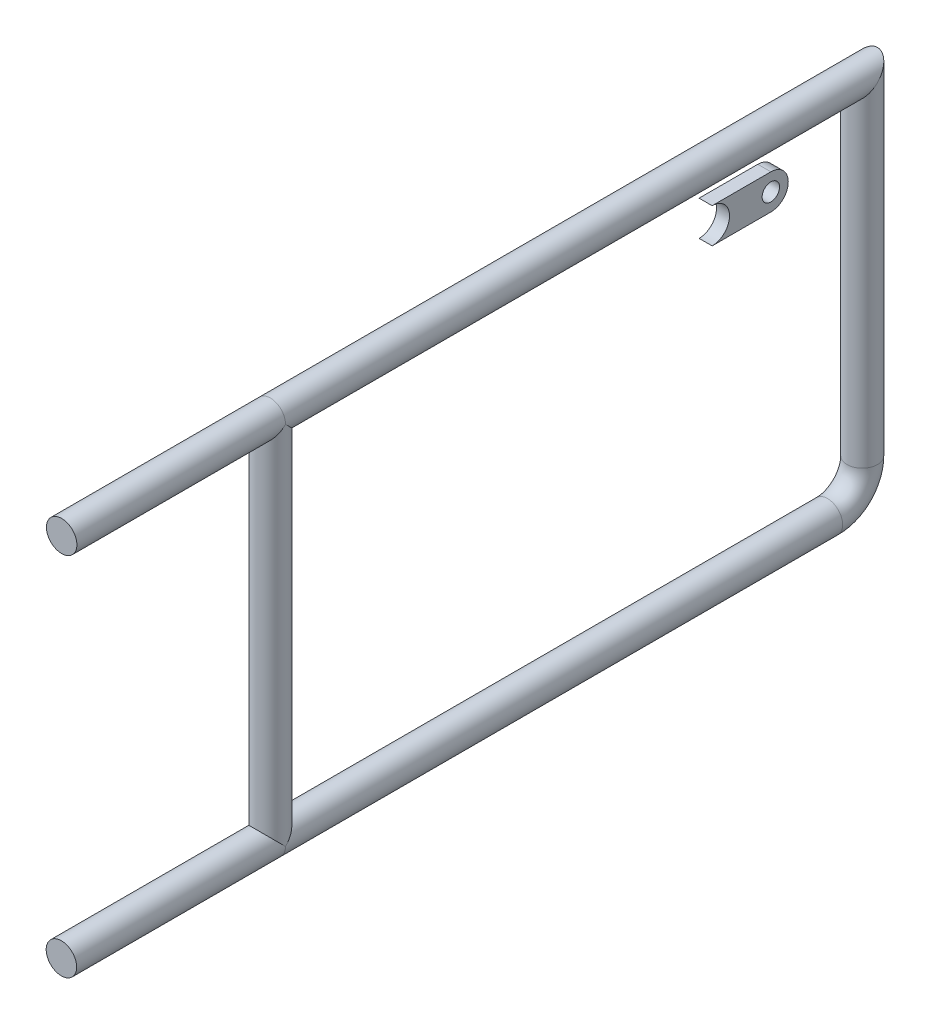
ISO-10303-21;
HEADER;
FILE_DESCRIPTION(('STEP AP214'),'2;1');
FILE_NAME('part.step','',(''),(''),'','','');
FILE_SCHEMA(('AUTOMOTIVE_DESIGN { 1 0 10303 214 1 1 1 1 }'));
ENDSEC;
DATA;
#1=APPLICATION_CONTEXT('core data for automotive mechanical design processes');
#2=APPLICATION_PROTOCOL_DEFINITION('international standard','automotive_design',2000,#1);
#3=PRODUCT_CONTEXT('',#1,'mechanical');
#4=PRODUCT('Part','Part','',(#3));
#5=PRODUCT_RELATED_PRODUCT_CATEGORY('part','',(#4));
#6=PRODUCT_DEFINITION_FORMATION('','',#4);
#7=PRODUCT_DEFINITION_CONTEXT('part definition',#1,'design');
#8=PRODUCT_DEFINITION('design','',#6,#7);
#9=PRODUCT_DEFINITION_SHAPE('','',#8);
#10=(LENGTH_UNIT() NAMED_UNIT(*) SI_UNIT(.MILLI.,.METRE.));
#11=(NAMED_UNIT(*) PLANE_ANGLE_UNIT() SI_UNIT($,.RADIAN.));
#12=(NAMED_UNIT(*) SI_UNIT($,.STERADIAN.) SOLID_ANGLE_UNIT());
#13=UNCERTAINTY_MEASURE_WITH_UNIT(LENGTH_MEASURE(1.E-05),#10,'distance_accuracy_value','');
#14=(GEOMETRIC_REPRESENTATION_CONTEXT(3) GLOBAL_UNCERTAINTY_ASSIGNED_CONTEXT((#13)) GLOBAL_UNIT_ASSIGNED_CONTEXT((#10,
#11,#12)) REPRESENTATION_CONTEXT('',''));
#15=CARTESIAN_POINT('',(0.,0.,0.));
#16=DIRECTION('',(0.,0.,1.));
#17=DIRECTION('',(1.,0.,0.));
#18=AXIS2_PLACEMENT_3D('',#15,#16,#17);
#19=CARTESIAN_POINT('',(9.525,-463.55,-464.982017060736));
#20=DIRECTION('',(-1.,0.,0.));
#21=DIRECTION('',(0.,0.,1.));
#22=AXIS2_PLACEMENT_3D('',#19,#20,#21);
#23=CYLINDRICAL_SURFACE('',#22,12.7);
#24=CARTESIAN_POINT('',(0.,-463.55,-464.982017060736));
#25=DIRECTION('',(1.,0.,0.));
#26=DIRECTION('',(0.,0.,-1.));
#27=AXIS2_PLACEMENT_3D('',#24,#25,#26);
#28=CIRCLE('',#27,12.7);
#29=CARTESIAN_POINT('',(0.,-476.25,-464.982017060736));
#30=VERTEX_POINT('',#29);
#31=CARTESIAN_POINT('',(0.,-450.85,-464.982017060736));
#32=VERTEX_POINT('',#31);
#33=EDGE_CURVE('E118',#30,#32,#28,.T.);
#34=ORIENTED_EDGE('',*,*,#33,.F.);
#35=DIRECTION('',(-1.,0.,0.));
#36=VECTOR('',#35,1.);
#37=CARTESIAN_POINT('',(9.525,-476.25,-464.982017060736));
#38=LINE('',#37,#36);
#39=CARTESIAN_POINT('',(9.525,-476.25,-464.982017060736));
#40=VERTEX_POINT('',#39);
#41=EDGE_CURVE('E12',#40,#30,#38,.T.);
#42=ORIENTED_EDGE('',*,*,#41,.F.);
#43=CARTESIAN_POINT('',(9.525,-463.55,-464.982017060736));
#44=DIRECTION('',(1.,0.,0.));
#45=DIRECTION('',(0.,0.,-1.));
#46=AXIS2_PLACEMENT_3D('',#43,#44,#45);
#47=CIRCLE('',#46,12.7);
#48=CARTESIAN_POINT('',(9.525,-450.85,-464.982017060736));
#49=VERTEX_POINT('',#48);
#50=EDGE_CURVE('E100',#40,#49,#47,.T.);
#51=ORIENTED_EDGE('',*,*,#50,.T.);
#52=DIRECTION('',(-1.,0.,0.));
#53=VECTOR('',#52,1.);
#54=CARTESIAN_POINT('',(9.525,-450.85,-464.982017060736));
#55=LINE('',#54,#53);
#56=EDGE_CURVE('E67',#49,#32,#55,.T.);
#57=ORIENTED_EDGE('',*,*,#56,.T.);
#58=EDGE_LOOP('',(#34,#42,#51,#57));
#59=FACE_BOUND('',#58,.T.);
#60=ADVANCED_FACE('F51',(#59),#23,.F.);
#61=CARTESIAN_POINT('',(9.525,-476.25,4.16333634234431E-13));
#62=DIRECTION('',(0.,1.,0.));
#63=DIRECTION('',(0.,0.,1.));
#64=AXIS2_PLACEMENT_3D('',#61,#62,#63);
#65=PLANE('',#64);
#66=DIRECTION('',(0.,0.,-1.));
#67=VECTOR('',#66,1.);
#68=CARTESIAN_POINT('',(0.,-476.25,4.16333634234431E-13));
#69=LINE('',#68,#67);
#70=CARTESIAN_POINT('',(0.,-476.25,-507.812779539151));
#71=VERTEX_POINT('',#70);
#72=EDGE_CURVE('E106',#30,#71,#69,.T.);
#73=ORIENTED_EDGE('',*,*,#72,.T.);
#74=DIRECTION('',(-1.,0.,0.));
#75=VECTOR('',#74,1.);
#76=CARTESIAN_POINT('',(9.525,-476.25,-507.812779539151));
#77=LINE('',#76,#75);
#78=CARTESIAN_POINT('',(9.525,-476.25,-507.812779539151));
#79=VERTEX_POINT('',#78);
#80=EDGE_CURVE('E59',#79,#71,#77,.T.);
#81=ORIENTED_EDGE('',*,*,#80,.F.);
#82=DIRECTION('',(0.,0.,-1.));
#83=VECTOR('',#82,1.);
#84=CARTESIAN_POINT('',(9.525,-476.25,4.16333634234431E-13));
#85=LINE('',#84,#83);
#86=EDGE_CURVE('E93',#40,#79,#85,.T.);
#87=ORIENTED_EDGE('',*,*,#86,.F.);
#88=ORIENTED_EDGE('',*,*,#41,.T.);
#89=EDGE_LOOP('',(#73,#81,#87,#88));
#90=FACE_BOUND('',#89,.T.);
#91=ADVANCED_FACE('F104',(#90),#65,.F.);
#92=CARTESIAN_POINT('',(9.525,-463.55,-507.812779539151));
#93=DIRECTION('',(-1.,0.,0.));
#94=DIRECTION('',(0.,0.,1.));
#95=AXIS2_PLACEMENT_3D('',#92,#93,#94);
#96=CYLINDRICAL_SURFACE('',#95,12.7);
#97=CARTESIAN_POINT('',(0.,-463.55,-507.812779539151));
#98=DIRECTION('',(1.,0.,0.));
#99=DIRECTION('',(0.,0.,-1.));
#100=AXIS2_PLACEMENT_3D('',#97,#98,#99);
#101=CIRCLE('',#100,12.7);
#102=CARTESIAN_POINT('',(0.,-450.85,-507.812779539151));
#103=VERTEX_POINT('',#102);
#104=EDGE_CURVE('E121',#71,#103,#101,.T.);
#105=ORIENTED_EDGE('',*,*,#104,.T.);
#106=DIRECTION('',(-1.,0.,0.));
#107=VECTOR('',#106,1.);
#108=CARTESIAN_POINT('',(9.525,-450.85,-507.812779539151));
#109=LINE('',#108,#107);
#110=CARTESIAN_POINT('',(9.525,-450.85,-507.812779539151));
#111=VERTEX_POINT('',#110);
#112=EDGE_CURVE('E81',#111,#103,#109,.T.);
#113=ORIENTED_EDGE('',*,*,#112,.F.);
#114=CARTESIAN_POINT('',(9.525,-463.55,-507.812779539151));
#115=DIRECTION('',(1.,0.,0.));
#116=DIRECTION('',(0.,0.,-1.));
#117=AXIS2_PLACEMENT_3D('',#114,#115,#116);
#118=CIRCLE('',#117,12.7);
#119=EDGE_CURVE('E99',#79,#111,#118,.T.);
#120=ORIENTED_EDGE('',*,*,#119,.F.);
#121=ORIENTED_EDGE('',*,*,#80,.T.);
#122=EDGE_LOOP('',(#105,#113,#120,#121));
#123=FACE_BOUND('',#122,.T.);
#124=ADVANCED_FACE('F109',(#123),#96,.T.);
#125=CARTESIAN_POINT('',(9.525,-450.85,3.94129173741928E-13));
#126=DIRECTION('',(0.,1.,0.));
#127=DIRECTION('',(0.,0.,1.));
#128=AXIS2_PLACEMENT_3D('',#125,#126,#127);
#129=PLANE('',#128);
#130=DIRECTION('',(0.,0.,-1.));
#131=VECTOR('',#130,1.);
#132=CARTESIAN_POINT('',(0.,-450.85,3.94129173741928E-13));
#133=LINE('',#132,#131);
#134=EDGE_CURVE('E123',#32,#103,#133,.T.);
#135=ORIENTED_EDGE('',*,*,#134,.F.);
#136=ORIENTED_EDGE('',*,*,#56,.F.);
#137=DIRECTION('',(0.,0.,-1.));
#138=VECTOR('',#137,1.);
#139=CARTESIAN_POINT('',(9.525,-450.85,3.94129173741928E-13));
#140=LINE('',#139,#138);
#141=EDGE_CURVE('E110',#49,#111,#140,.T.);
#142=ORIENTED_EDGE('',*,*,#141,.T.);
#143=ORIENTED_EDGE('',*,*,#112,.T.);
#144=EDGE_LOOP('',(#135,#136,#142,#143));
#145=FACE_BOUND('',#144,.T.);
#146=ADVANCED_FACE('F132',(#145),#129,.T.);
#147=CARTESIAN_POINT('',(9.525,-463.55,-507.812779539151));
#148=DIRECTION('',(-1.,0.,0.));
#149=DIRECTION('',(0.,0.,1.));
#150=AXIS2_PLACEMENT_3D('',#147,#148,#149);
#151=CYLINDRICAL_SURFACE('',#150,6.34999999999994);
#152=CARTESIAN_POINT('',(9.525,-463.55,-507.812779539151));
#153=DIRECTION('',(1.,0.,0.));
#154=DIRECTION('',(0.,0.,-1.));
#155=AXIS2_PLACEMENT_3D('',#152,#153,#154);
#156=CIRCLE('',#155,6.34999999999994);
#157=CARTESIAN_POINT('',(9.525,-463.55,-501.462779539151));
#158=VERTEX_POINT('',#157);
#159=EDGE_CURVE('E112',#158,#158,#156,.T.);
#160=CARTESIAN_POINT('',(0.,-463.55,-507.812779539151));
#161=DIRECTION('',(1.,0.,0.));
#162=DIRECTION('',(0.,0.,-1.));
#163=AXIS2_PLACEMENT_3D('',#160,#161,#162);
#164=CIRCLE('',#163,6.34999999999994);
#165=CARTESIAN_POINT('',(0.,-463.55,-501.462779539151));
#166=VERTEX_POINT('',#165);
#167=EDGE_CURVE('E126',#166,#166,#164,.T.);
#168=CARTESIAN_POINT('',(9.525,-463.55,-501.462779539151));
#169=CARTESIAN_POINT('',(9.42578125,-463.55,-501.462779539151));
#170=CARTESIAN_POINT('',(9.3265625,-463.55,-501.462779539151));
#171=CARTESIAN_POINT('',(9.128125,-463.55,-501.462779539151));
#172=CARTESIAN_POINT('',(9.02890625,-463.55,-501.462779539151));
#173=CARTESIAN_POINT('',(8.83046875,-463.55,-501.462779539151));
#174=CARTESIAN_POINT('',(8.73125,-463.55,-501.462779539151));
#175=CARTESIAN_POINT('',(8.5328125,-463.55,-501.462779539151));
#176=CARTESIAN_POINT('',(8.43359375,-463.55,-501.462779539151));
#177=CARTESIAN_POINT('',(8.23515625,-463.55,-501.462779539151));
#178=CARTESIAN_POINT('',(8.1359375,-463.55,-501.462779539151));
#179=CARTESIAN_POINT('',(7.9375,-463.55,-501.462779539151));
#180=CARTESIAN_POINT('',(7.83828125,-463.55,-501.462779539151));
#181=CARTESIAN_POINT('',(7.63984375,-463.55,-501.462779539151));
#182=CARTESIAN_POINT('',(7.540625,-463.55,-501.462779539151));
#183=CARTESIAN_POINT('',(7.3421875,-463.55,-501.462779539151));
#184=CARTESIAN_POINT('',(7.24296875,-463.55,-501.462779539151));
#185=CARTESIAN_POINT('',(7.04453125,-463.55,-501.462779539151));
#186=CARTESIAN_POINT('',(6.9453125,-463.55,-501.462779539151));
#187=CARTESIAN_POINT('',(6.746875,-463.55,-501.462779539151));
#188=CARTESIAN_POINT('',(6.64765625,-463.55,-501.462779539151));
#189=CARTESIAN_POINT('',(6.44921875,-463.55,-501.462779539151));
#190=CARTESIAN_POINT('',(6.35,-463.55,-501.462779539151));
#191=CARTESIAN_POINT('',(6.1515625,-463.55,-501.462779539151));
#192=CARTESIAN_POINT('',(6.05234375,-463.55,-501.462779539151));
#193=CARTESIAN_POINT('',(5.85390625,-463.55,-501.462779539151));
#194=CARTESIAN_POINT('',(5.7546875,-463.55,-501.462779539151));
#195=CARTESIAN_POINT('',(5.55625,-463.55,-501.462779539151));
#196=CARTESIAN_POINT('',(5.45703125,-463.55,-501.462779539151));
#197=CARTESIAN_POINT('',(5.25859375,-463.55,-501.462779539151));
#198=CARTESIAN_POINT('',(5.159375,-463.55,-501.462779539151));
#199=CARTESIAN_POINT('',(4.9609375,-463.55,-501.462779539151));
#200=CARTESIAN_POINT('',(4.86171875,-463.55,-501.462779539151));
#201=CARTESIAN_POINT('',(4.66328125,-463.55,-501.462779539151));
#202=CARTESIAN_POINT('',(4.5640625,-463.55,-501.462779539151));
#203=CARTESIAN_POINT('',(4.365625,-463.55,-501.462779539151));
#204=CARTESIAN_POINT('',(4.26640625,-463.55,-501.462779539151));
#205=CARTESIAN_POINT('',(4.06796875,-463.55,-501.462779539151));
#206=CARTESIAN_POINT('',(3.96875,-463.55,-501.462779539151));
#207=CARTESIAN_POINT('',(3.7703125,-463.55,-501.462779539151));
#208=CARTESIAN_POINT('',(3.67109375,-463.55,-501.462779539151));
#209=CARTESIAN_POINT('',(3.47265625,-463.55,-501.462779539151));
#210=CARTESIAN_POINT('',(3.3734375,-463.55,-501.462779539151));
#211=CARTESIAN_POINT('',(3.175,-463.55,-501.462779539151));
#212=CARTESIAN_POINT('',(3.07578125,-463.55,-501.462779539151));
#213=CARTESIAN_POINT('',(2.87734375,-463.55,-501.462779539151));
#214=CARTESIAN_POINT('',(2.778125,-463.55,-501.462779539151));
#215=CARTESIAN_POINT('',(2.5796875,-463.55,-501.462779539151));
#216=CARTESIAN_POINT('',(2.48046875,-463.55,-501.462779539151));
#217=CARTESIAN_POINT('',(2.28203125,-463.55,-501.462779539151));
#218=CARTESIAN_POINT('',(2.1828125,-463.55,-501.462779539151));
#219=CARTESIAN_POINT('',(1.984375,-463.55,-501.462779539151));
#220=CARTESIAN_POINT('',(1.88515625,-463.55,-501.462779539151));
#221=CARTESIAN_POINT('',(1.68671875,-463.55,-501.462779539151));
#222=CARTESIAN_POINT('',(1.5875,-463.55,-501.462779539151));
#223=CARTESIAN_POINT('',(1.3890625,-463.55,-501.462779539151));
#224=CARTESIAN_POINT('',(1.28984375,-463.55,-501.462779539151));
#225=CARTESIAN_POINT('',(1.09140625,-463.55,-501.462779539151));
#226=CARTESIAN_POINT('',(0.992187500000001,-463.55,-501.462779539151));
#227=CARTESIAN_POINT('',(0.793750000000001,-463.55,-501.462779539151));
#228=CARTESIAN_POINT('',(0.69453125,-463.55,-501.462779539151));
#229=CARTESIAN_POINT('',(0.49609375,-463.55,-501.462779539151));
#230=CARTESIAN_POINT('',(0.396875,-463.55,-501.462779539151));
#231=CARTESIAN_POINT('',(0.1984375,-463.55,-501.462779539151));
#232=CARTESIAN_POINT('',(0.0992187500000001,-463.55,-501.462779539151));
#233=CARTESIAN_POINT('',(0.,-463.55,-501.462779539151));
#234=B_SPLINE_CURVE_WITH_KNOTS('',3,(#168,#169,#170,#171,#172,#173,#174,#175,#176,#177,#178,
#179,#180,#181,#182,#183,#184,#185,#186,#187,#188,#189,#190,#191,#192,#193,#194,#195,#196,#197,
#198,#199,#200,#201,#202,#203,#204,#205,#206,#207,#208,#209,#210,#211,#212,#213,#214,#215,#216,
#217,#218,#219,#220,#221,#222,#223,#224,#225,#226,#227,#228,#229,#230,#231,#232,#233),
.UNSPECIFIED.,.F.,.F.,(4,2,2,2,2,2,2,2,2,2,2,2,2,2,2,2,2,2,2,2,2,2,2,2,2,2,2,2,2,2,2,2,4),(0.,
0.297656249999998,0.595312499999999,0.892968749999999,1.190625,1.48828125,1.7859375,2.08359375,
2.38125,2.67890625,2.9765625,3.27421875,3.571875,3.86953125,4.1671875,4.46484375,4.7625,
5.06015625,5.3578125,5.65546875,5.953125,6.25078125,6.5484375,6.84609375,7.14375,7.44140625,
7.7390625,8.03671875,8.334375,8.63203125,8.9296875,9.22734375,9.525),.UNSPECIFIED.);
#235=EDGE_CURVE('BSEAM134',#158,#166,#234,.T.);
#236=ORIENTED_EDGE('',*,*,#159,.T.);
#237=ORIENTED_EDGE('',*,*,#167,.F.);
#238=ORIENTED_EDGE('',*,*,#235,.T.);
#239=ORIENTED_EDGE('',*,*,#235,.F.);
#240=EDGE_LOOP('',(#236,#238,#237,#239));
#241=FACE_BOUND('',#240,.T.);
#242=ADVANCED_FACE('F134',(#241),#151,.F.);
#243=CARTESIAN_POINT('',(9.525,0.,0.));
#244=DIRECTION('',(1.,0.,0.));
#245=DIRECTION('',(0.,0.,-1.));
#246=AXIS2_PLACEMENT_3D('',#243,#244,#245);
#247=PLANE('',#246);
#248=ORIENTED_EDGE('',*,*,#50,.F.);
#249=ORIENTED_EDGE('',*,*,#86,.T.);
#250=ORIENTED_EDGE('',*,*,#119,.T.);
#251=ORIENTED_EDGE('',*,*,#141,.F.);
#252=EDGE_LOOP('',(#248,#249,#250,#251));
#253=FACE_BOUND('',#252,.T.);
#254=ORIENTED_EDGE('',*,*,#159,.F.);
#255=EDGE_LOOP('',(#254));
#256=FACE_BOUND('',#255,.T.);
#257=ADVANCED_FACE('F95',(#253,#256),#247,.T.);
#258=CARTESIAN_POINT('',(0.,0.,0.));
#259=DIRECTION('',(1.,0.,0.));
#260=DIRECTION('',(0.,0.,-1.));
#261=AXIS2_PLACEMENT_3D('',#258,#259,#260);
#262=PLANE('',#261);
#263=ORIENTED_EDGE('',*,*,#33,.T.);
#264=ORIENTED_EDGE('',*,*,#134,.T.);
#265=ORIENTED_EDGE('',*,*,#104,.F.);
#266=ORIENTED_EDGE('',*,*,#72,.F.);
#267=EDGE_LOOP('',(#263,#264,#265,#266));
#268=FACE_BOUND('',#267,.T.);
#269=ORIENTED_EDGE('',*,*,#167,.T.);
#270=EDGE_LOOP('',(#269));
#271=FACE_BOUND('',#270,.T.);
#272=ADVANCED_FACE('F172',(#268,#271),#262,.F.);
#273=CLOSED_SHELL('',(#60,#91,#124,#146,#242,#257,#272));
#274=MANIFOLD_SOLID_BREP('B2',#273);
#275=CARTESIAN_POINT('',(0.,-698.5,0.18722046084918));
#276=DIRECTION('',(0.,0.,1.));
#277=DIRECTION('',(1.,0.,0.));
#278=AXIS2_PLACEMENT_3D('',#275,#276,#277);
#279=PLANE('',#278);
#280=CARTESIAN_POINT('',(0.,-698.5,0.18722046084918));
#281=DIRECTION('',(0.,0.,1.));
#282=DIRECTION('',(1.,0.,0.));
#283=AXIS2_PLACEMENT_3D('',#280,#281,#282);
#284=CIRCLE('',#283,11.1125);
#285=CARTESIAN_POINT('',(11.1125,-698.5,0.18722046084918));
#286=VERTEX_POINT('',#285);
#287=EDGE_CURVE('E252',#286,#286,#284,.T.);
#288=ORIENTED_EDGE('',*,*,#287,.T.);
#289=EDGE_LOOP('',(#288));
#290=FACE_BOUND('',#289,.T.);
#291=ADVANCED_FACE('F201',(#290),#279,.T.);
#292=CARTESIAN_POINT('',(0.,-431.8,0.));
#293=DIRECTION('',(0.,0.,-1.));
#294=DIRECTION('',(1.,0.,0.));
#295=AXIS2_PLACEMENT_3D('',#292,#293,#294);
#296=PLANE('',#295);
#297=CARTESIAN_POINT('',(0.,-431.8,0.));
#298=DIRECTION('',(0.,0.,-1.));
#299=DIRECTION('',(1.,0.,0.));
#300=AXIS2_PLACEMENT_3D('',#297,#298,#299);
#301=CIRCLE('',#300,11.1125);
#302=CARTESIAN_POINT('',(11.1125,-431.8,0.));
#303=VERTEX_POINT('',#302);
#304=EDGE_CURVE('E208',#303,#303,#301,.T.);
#305=ORIENTED_EDGE('',*,*,#304,.F.);
#306=EDGE_LOOP('',(#305));
#307=FACE_BOUND('',#306,.T.);
#308=ADVANCED_FACE('F272',(#307),#296,.F.);
#309=CARTESIAN_POINT('',(0.,-407.2525,-584.012779539151));
#310=DIRECTION('',(0.,-1.,0.));
#311=DIRECTION('',(0.,0.,-1.));
#312=AXIS2_PLACEMENT_3D('',#309,#310,#311);
#313=CYLINDRICAL_SURFACE('',#312,11.1125);
#314=CARTESIAN_POINT('',(0.,-431.8,-584.012779539151));
#315=DIRECTION('',(0.,-0.707106781186548,-0.707106781186548));
#316=DIRECTION('',(0.,0.707106781186548,-0.707106781186548));
#317=AXIS2_PLACEMENT_3D('',#314,#315,#316);
#318=ELLIPSE('',#317,15.715448211871,11.1125);
#319=CARTESIAN_POINT('',(0.,-420.6875,-595.125279539151));
#320=VERTEX_POINT('',#319);
#321=EDGE_CURVE('E236',#320,#320,#318,.F.);
#322=ORIENTED_EDGE('',*,*,#321,.F.);
#323=EDGE_LOOP('',(#322));
#324=FACE_BOUND('',#323,.T.);
#325=CARTESIAN_POINT('',(0.,-673.1,-584.012779539151));
#326=DIRECTION('',(0.,-1.,0.));
#327=DIRECTION('',(1.,0.,0.));
#328=AXIS2_PLACEMENT_3D('',#325,#326,#327);
#329=CIRCLE('',#328,11.1125);
#330=CARTESIAN_POINT('',(0.,-673.1,-595.125279539151));
#331=VERTEX_POINT('',#330);
#332=EDGE_CURVE('E258',#331,#331,#329,.T.);
#333=ORIENTED_EDGE('',*,*,#332,.F.);
#334=EDGE_LOOP('',(#333));
#335=FACE_BOUND('',#334,.T.);
#336=ADVANCED_FACE('F270',(#324,#335),#313,.T.);
#337=CARTESIAN_POINT('',(0.,-673.1,-558.612779539151));
#338=DIRECTION('',(-1.,0.,0.));
#339=DIRECTION('',(0.,0.,1.));
#340=AXIS2_PLACEMENT_3D('',#337,#338,#339);
#341=TOROIDAL_SURFACE('',#340,25.4,11.1125);
#342=CARTESIAN_POINT('',(0.,-698.5,-558.612779539157));
#343=DIRECTION('',(0.,0.,1.));
#344=DIRECTION('',(1.,0.,0.));
#345=AXIS2_PLACEMENT_3D('',#342,#343,#344);
#346=CIRCLE('',#345,11.1125);
#347=CARTESIAN_POINT('',(0.,-709.6125,-558.612779539159));
#348=VERTEX_POINT('',#347);
#349=EDGE_CURVE('E263',#348,#348,#346,.T.);
#350=CARTESIAN_POINT('',(0.,-673.1,-558.612779539151));
#351=DIRECTION('',(-1.,0.,0.));
#352=DIRECTION('',(0.,0.,1.));
#353=AXIS2_PLACEMENT_3D('',#350,#351,#352);
#354=CIRCLE('',#353,36.5125);
#355=EDGE_CURVE('',#331,#348,#354,.T.);
#356=ORIENTED_EDGE('',*,*,#332,.T.);
#357=ORIENTED_EDGE('',*,*,#349,.F.);
#358=ORIENTED_EDGE('',*,*,#355,.T.);
#359=ORIENTED_EDGE('',*,*,#355,.F.);
#360=EDGE_LOOP('',(#356,#358,#357,#359));
#361=FACE_BOUND('',#360,.T.);
#362=ADVANCED_FACE('F268',(#361),#341,.T.);
#363=CARTESIAN_POINT('',(0.,-698.5,-558.612779539151));
#364=DIRECTION('',(0.,0.,1.));
#365=DIRECTION('',(1.,0.,0.));
#366=AXIS2_PLACEMENT_3D('',#363,#364,#365);
#367=CYLINDRICAL_SURFACE('',#366,11.1125);
#368=CARTESIAN_POINT('',(0.,-698.5,-152.212779539151));
#369=DIRECTION('',(0.,0.,1.));
#370=DIRECTION('',(1.,0.,0.));
#371=AXIS2_PLACEMENT_3D('',#368,#369,#370);
#372=CIRCLE('',#371,11.1125);
#373=CARTESIAN_POINT('',(-11.1125,-698.5,-152.212779539151));
#374=VERTEX_POINT('',#373);
#375=CARTESIAN_POINT('',(11.1125,-698.5,-152.212779539151));
#376=VERTEX_POINT('',#375);
#377=EDGE_CURVE('E261',#374,#376,#372,.T.);
#378=ORIENTED_EDGE('',*,*,#377,.F.);
#379=CARTESIAN_POINT('',(0.,-698.5,-152.212779539151));
#380=DIRECTION('',(0.,0.707106781186547,0.707106781186547));
#381=DIRECTION('',(0.,-0.707106781186548,0.707106781186547));
#382=AXIS2_PLACEMENT_3D('',#379,#380,#381);
#383=ELLIPSE('',#382,15.715448211871,11.1125);
#384=EDGE_CURVE('E242',#376,#374,#383,.T.);
#385=ORIENTED_EDGE('',*,*,#384,.F.);
#386=EDGE_LOOP('',(#378,#385));
#387=FACE_BOUND('',#386,.T.);
#388=ORIENTED_EDGE('',*,*,#349,.T.);
#389=EDGE_LOOP('',(#388));
#390=FACE_BOUND('',#389,.T.);
#391=ADVANCED_FACE('F279',(#387,#390),#367,.T.);
#392=CARTESIAN_POINT('',(0.,-698.5,-152.212779539151));
#393=DIRECTION('',(0.,0.,1.));
#394=DIRECTION('',(1.,0.,0.));
#395=AXIS2_PLACEMENT_3D('',#392,#393,#394);
#396=CYLINDRICAL_SURFACE('',#395,11.1125);
#397=CARTESIAN_POINT('',(0.,-698.5,-152.212779539151));
#398=DIRECTION('',(0.,-0.707106781186548,0.707106781186547));
#399=DIRECTION('',(0.,-0.707106781186547,-0.707106781186548));
#400=AXIS2_PLACEMENT_3D('',#397,#398,#399);
#401=ELLIPSE('',#400,15.715448211871,11.1125);
#402=EDGE_CURVE('E214',#374,#376,#401,.F.);
#403=ORIENTED_EDGE('',*,*,#402,.F.);
#404=ORIENTED_EDGE('',*,*,#377,.T.);
#405=EDGE_LOOP('',(#403,#404));
#406=FACE_BOUND('',#405,.T.);
#407=ORIENTED_EDGE('',*,*,#287,.F.);
#408=EDGE_LOOP('',(#407));
#409=FACE_BOUND('',#408,.T.);
#410=ADVANCED_FACE('F288',(#406,#409),#396,.T.);
#411=CARTESIAN_POINT('',(0.,-431.8,0.));
#412=DIRECTION('',(0.,0.,-1.));
#413=DIRECTION('',(-1.,0.,0.));
#414=AXIS2_PLACEMENT_3D('',#411,#412,#413);
#415=CYLINDRICAL_SURFACE('',#414,11.1125);
#416=CARTESIAN_POINT('',(0.,-431.8,-152.212779539151));
#417=DIRECTION('',(0.,-0.707106781186547,-0.707106781186547));
#418=DIRECTION('',(0.,0.707106781186548,-0.707106781186547));
#419=AXIS2_PLACEMENT_3D('',#416,#417,#418);
#420=ELLIPSE('',#419,15.715448211871,11.1125);
#421=CARTESIAN_POINT('',(11.1125,-431.8,-152.212779539151));
#422=VERTEX_POINT('',#421);
#423=CARTESIAN_POINT('',(-11.1125,-431.8,-152.212779539151));
#424=VERTEX_POINT('',#423);
#425=EDGE_CURVE('E238',#422,#424,#420,.T.);
#426=ORIENTED_EDGE('',*,*,#425,.F.);
#427=CARTESIAN_POINT('',(0.,-431.8,-152.212779539151));
#428=DIRECTION('',(0.,0.,-1.));
#429=DIRECTION('',(1.,0.,0.));
#430=AXIS2_PLACEMENT_3D('',#427,#428,#429);
#431=CIRCLE('',#430,11.1125);
#432=EDGE_CURVE('E230',#424,#422,#431,.T.);
#433=ORIENTED_EDGE('',*,*,#432,.F.);
#434=EDGE_LOOP('',(#426,#433));
#435=FACE_BOUND('',#434,.T.);
#436=ORIENTED_EDGE('',*,*,#304,.T.);
#437=EDGE_LOOP('',(#436));
#438=FACE_BOUND('',#437,.T.);
#439=ADVANCED_FACE('F239',(#435,#438),#415,.T.);
#440=CARTESIAN_POINT('',(0.,-431.8,-152.212779539151));
#441=DIRECTION('',(0.,0.,-1.));
#442=DIRECTION('',(-1.,0.,0.));
#443=AXIS2_PLACEMENT_3D('',#440,#441,#442);
#444=CYLINDRICAL_SURFACE('',#443,11.1125);
#445=CARTESIAN_POINT('',(0.,-431.8,-152.212779539151));
#446=DIRECTION('',(0.,0.707106781186548,-0.707106781186547));
#447=DIRECTION('',(0.,-0.707106781186547,-0.707106781186547));
#448=AXIS2_PLACEMENT_3D('',#445,#446,#447);
#449=ELLIPSE('',#448,15.715448211871,11.1125);
#450=EDGE_CURVE('E49',#424,#422,#449,.F.);
#451=ORIENTED_EDGE('',*,*,#450,.F.);
#452=ORIENTED_EDGE('',*,*,#432,.T.);
#453=EDGE_LOOP('',(#451,#452));
#454=FACE_BOUND('',#453,.T.);
#455=ORIENTED_EDGE('',*,*,#321,.T.);
#456=EDGE_LOOP('',(#455));
#457=FACE_BOUND('',#456,.T.);
#458=ADVANCED_FACE('F232',(#454,#457),#444,.T.);
#459=CARTESIAN_POINT('',(0.,-431.8,-152.212779539151));
#460=DIRECTION('',(0.,-1.,0.));
#461=DIRECTION('',(0.,0.,-1.));
#462=AXIS2_PLACEMENT_3D('',#459,#460,#461);
#463=CYLINDRICAL_SURFACE('',#462,11.1125);
#464=ORIENTED_EDGE('',*,*,#450,.T.);
#465=ORIENTED_EDGE('',*,*,#425,.T.);
#466=EDGE_LOOP('',(#464,#465));
#467=FACE_BOUND('',#466,.T.);
#468=ORIENTED_EDGE('',*,*,#402,.T.);
#469=ORIENTED_EDGE('',*,*,#384,.T.);
#470=EDGE_LOOP('',(#468,#469));
#471=FACE_BOUND('',#470,.T.);
#472=ADVANCED_FACE('F244',(#467,#471),#463,.T.);
#473=CLOSED_SHELL('',(#291,#308,#336,#362,#391,#410,#439,#458,#472));
#474=MANIFOLD_SOLID_BREP('B6_NOT_SHOWN',#473);
#475=ADVANCED_BREP_SHAPE_REPRESENTATION('',(#18,#274,#474),#14);
#476=SHAPE_DEFINITION_REPRESENTATION(#9,#475);
ENDSEC;
END-ISO-10303-21;
